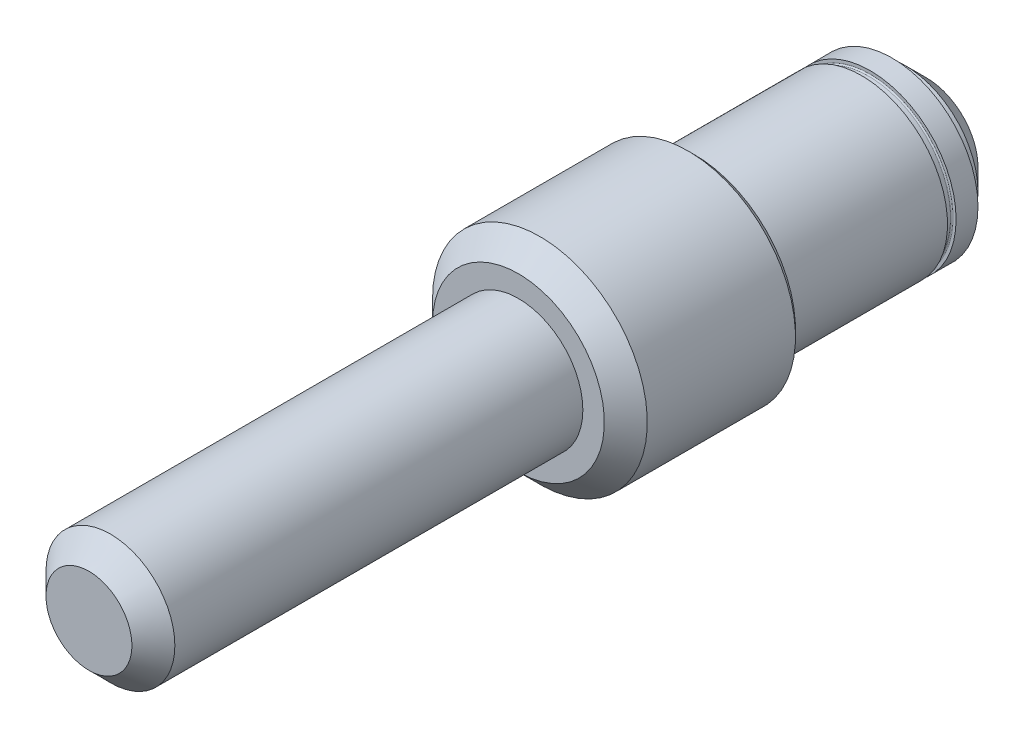
ISO-10303-21;
HEADER;
FILE_DESCRIPTION(('STEP AP214'),'2;1');
FILE_NAME('part.step','',(''),(''),'','','');
FILE_SCHEMA(('AUTOMOTIVE_DESIGN { 1 0 10303 214 1 1 1 1 }'));
ENDSEC;
DATA;
#1=APPLICATION_CONTEXT('core data for automotive mechanical design processes');
#2=APPLICATION_PROTOCOL_DEFINITION('international standard','automotive_design',2000,#1);
#3=PRODUCT_CONTEXT('',#1,'mechanical');
#4=PRODUCT('Part','Part','',(#3));
#5=PRODUCT_RELATED_PRODUCT_CATEGORY('part','',(#4));
#6=PRODUCT_DEFINITION_FORMATION('','',#4);
#7=PRODUCT_DEFINITION_CONTEXT('part definition',#1,'design');
#8=PRODUCT_DEFINITION('design','',#6,#7);
#9=PRODUCT_DEFINITION_SHAPE('','',#8);
#10=(LENGTH_UNIT() NAMED_UNIT(*) SI_UNIT(.MILLI.,.METRE.));
#11=(NAMED_UNIT(*) PLANE_ANGLE_UNIT() SI_UNIT($,.RADIAN.));
#12=(NAMED_UNIT(*) SI_UNIT($,.STERADIAN.) SOLID_ANGLE_UNIT());
#13=UNCERTAINTY_MEASURE_WITH_UNIT(LENGTH_MEASURE(1.E-05),#10,'distance_accuracy_value','');
#14=(GEOMETRIC_REPRESENTATION_CONTEXT(3) GLOBAL_UNCERTAINTY_ASSIGNED_CONTEXT((#13)) GLOBAL_UNIT_ASSIGNED_CONTEXT((#10,
#11,#12)) REPRESENTATION_CONTEXT('',''));
#15=CARTESIAN_POINT('',(0.,0.,0.));
#16=DIRECTION('',(0.,0.,1.));
#17=DIRECTION('',(1.,0.,0.));
#18=AXIS2_PLACEMENT_3D('',#15,#16,#17);
#19=CARTESIAN_POINT('',(0.,0.,0.));
#20=DIRECTION('',(0.,0.,1.));
#21=DIRECTION('',(1.,0.,0.));
#22=AXIS2_PLACEMENT_3D('',#19,#20,#21);
#23=CYLINDRICAL_SURFACE('',#22,20.);
#24=CARTESIAN_POINT('',(0.,0.,-179.9));
#25=DIRECTION('',(0.,0.,-1.));
#26=DIRECTION('',(-1.,0.,0.));
#27=AXIS2_PLACEMENT_3D('',#24,#25,#26);
#28=CIRCLE('',#27,20.);
#29=CARTESIAN_POINT('',(-20.,0.,-179.9));
#30=VERTEX_POINT('',#29);
#31=EDGE_CURVE('E215',#30,#30,#28,.T.);
#32=ORIENTED_EDGE('',*,*,#31,.F.);
#33=EDGE_LOOP('',(#32));
#34=FACE_BOUND('',#33,.T.);
#35=CARTESIAN_POINT('',(0.,0.,-141.));
#36=DIRECTION('',(0.,0.,-1.));
#37=DIRECTION('',(-1.,0.,0.));
#38=AXIS2_PLACEMENT_3D('',#35,#36,#37);
#39=CIRCLE('',#38,20.);
#40=CARTESIAN_POINT('',(-20.,0.,-141.));
#41=VERTEX_POINT('',#40);
#42=EDGE_CURVE('E213',#41,#41,#39,.T.);
#43=ORIENTED_EDGE('',*,*,#42,.T.);
#44=EDGE_LOOP('',(#43));
#45=FACE_BOUND('',#44,.T.);
#46=ADVANCED_FACE('F43',(#34,#45),#23,.T.);
#47=CARTESIAN_POINT('',(0.,0.,-179.9));
#48=DIRECTION('',(0.,0.,-1.));
#49=DIRECTION('',(-1.,0.,0.));
#50=AXIS2_PLACEMENT_3D('',#47,#48,#49);
#51=PLANE('',#50);
#52=CARTESIAN_POINT('',(0.,0.,-179.9));
#53=DIRECTION('',(0.,0.,-1.));
#54=DIRECTION('',(-1.,0.,0.));
#55=AXIS2_PLACEMENT_3D('',#52,#53,#54);
#56=CIRCLE('',#55,19.3);
#57=CARTESIAN_POINT('',(-19.3,0.,-179.9));
#58=VERTEX_POINT('',#57);
#59=EDGE_CURVE('E144',#58,#58,#56,.F.);
#60=ORIENTED_EDGE('',*,*,#59,.T.);
#61=EDGE_LOOP('',(#60));
#62=FACE_BOUND('',#61,.T.);
#63=ORIENTED_EDGE('',*,*,#31,.T.);
#64=EDGE_LOOP('',(#63));
#65=FACE_BOUND('',#64,.T.);
#66=ADVANCED_FACE('F74',(#62,#65),#51,.T.);
#67=CARTESIAN_POINT('',(0.,0.,-181.9));
#68=DIRECTION('',(0.,0.,-1.));
#69=DIRECTION('',(-1.,0.,0.));
#70=AXIS2_PLACEMENT_3D('',#67,#68,#69);
#71=PLANE('',#70);
#72=CARTESIAN_POINT('',(0.,0.,-181.9));
#73=DIRECTION('',(0.,0.,-1.));
#74=DIRECTION('',(-1.,0.,0.));
#75=AXIS2_PLACEMENT_3D('',#72,#73,#74);
#76=CIRCLE('',#75,19.3);
#77=CARTESIAN_POINT('',(-19.3,0.,-181.9));
#78=VERTEX_POINT('',#77);
#79=EDGE_CURVE('E150',#78,#78,#76,.T.);
#80=ORIENTED_EDGE('',*,*,#79,.T.);
#81=EDGE_LOOP('',(#80));
#82=FACE_BOUND('',#81,.T.);
#83=CARTESIAN_POINT('',(0.,0.,-181.9));
#84=DIRECTION('',(0.,0.,-1.));
#85=DIRECTION('',(-1.,0.,0.));
#86=AXIS2_PLACEMENT_3D('',#83,#84,#85);
#87=CIRCLE('',#86,20.);
#88=CARTESIAN_POINT('',(-20.,0.,-181.9));
#89=VERTEX_POINT('',#88);
#90=EDGE_CURVE('E106',#89,#89,#87,.T.);
#91=ORIENTED_EDGE('',*,*,#90,.F.);
#92=EDGE_LOOP('',(#91));
#93=FACE_BOUND('',#92,.T.);
#94=ADVANCED_FACE('F66',(#82,#93),#71,.F.);
#95=CARTESIAN_POINT('',(0.,0.,-179.9));
#96=DIRECTION('',(0.,0.,-1.));
#97=DIRECTION('',(-1.,0.,0.));
#98=AXIS2_PLACEMENT_3D('',#95,#96,#97);
#99=CYLINDRICAL_SURFACE('',#98,19.);
#100=CARTESIAN_POINT('',(0.,0.,-180.2));
#101=DIRECTION('',(0.,0.,-1.));
#102=DIRECTION('',(-1.,0.,0.));
#103=AXIS2_PLACEMENT_3D('',#100,#101,#102);
#104=CIRCLE('',#103,19.);
#105=CARTESIAN_POINT('',(-19.,0.,-180.2));
#106=VERTEX_POINT('',#105);
#107=EDGE_CURVE('E142',#106,#106,#104,.T.);
#108=ORIENTED_EDGE('',*,*,#107,.T.);
#109=EDGE_LOOP('',(#108));
#110=FACE_BOUND('',#109,.T.);
#111=CARTESIAN_POINT('',(0.,0.,-181.6));
#112=DIRECTION('',(0.,0.,-1.));
#113=DIRECTION('',(-1.,0.,0.));
#114=AXIS2_PLACEMENT_3D('',#111,#112,#113);
#115=CIRCLE('',#114,19.);
#116=CARTESIAN_POINT('',(-19.,0.,-181.6));
#117=VERTEX_POINT('',#116);
#118=EDGE_CURVE('E137',#117,#117,#115,.F.);
#119=ORIENTED_EDGE('',*,*,#118,.T.);
#120=EDGE_LOOP('',(#119));
#121=FACE_BOUND('',#120,.T.);
#122=ADVANCED_FACE('F60',(#110,#121),#99,.T.);
#123=CARTESIAN_POINT('',(0.,0.,-190.));
#124=DIRECTION('',(0.,0.,-1.));
#125=DIRECTION('',(-1.,0.,0.));
#126=AXIS2_PLACEMENT_3D('',#123,#124,#125);
#127=CONICAL_SURFACE('',#126,0.,0.785398163397451);
#128=CARTESIAN_POINT('',(0.,0.,-195.));
#129=DIRECTION('',(0.,0.,1.));
#130=DIRECTION('',(1.,0.,0.));
#131=AXIS2_PLACEMENT_3D('',#128,#129,#130);
#132=CIRCLE('',#131,5.);
#133=CARTESIAN_POINT('',(5.,0.,-195.));
#134=VERTEX_POINT('',#133);
#135=EDGE_CURVE('E120',#134,#134,#132,.T.);
#136=ORIENTED_EDGE('',*,*,#135,.F.);
#137=EDGE_LOOP('',(#136));
#138=FACE_BOUND('',#137,.T.);
#139=CARTESIAN_POINT('',(0.,0.,-190.));
#140=VERTEX_POINT('',#139);
#141=VERTEX_LOOP('',#140);
#142=FACE_BOUND('',#141,.T.);
#143=ADVANCED_FACE('F53',(#138,#142),#127,.F.);
#144=CARTESIAN_POINT('',(0.,17.,-195.));
#145=DIRECTION('',(0.,0.,1.));
#146=DIRECTION('',(1.,0.,0.));
#147=AXIS2_PLACEMENT_3D('',#144,#145,#146);
#148=PLANE('',#147);
#149=CARTESIAN_POINT('',(0.,0.,-195.));
#150=DIRECTION('',(0.,0.,1.));
#151=DIRECTION('',(1.,0.,0.));
#152=AXIS2_PLACEMENT_3D('',#149,#150,#151);
#153=CIRCLE('',#152,12.);
#154=CARTESIAN_POINT('',(12.,0.,-195.));
#155=VERTEX_POINT('',#154);
#156=EDGE_CURVE('E133',#155,#155,#153,.F.);
#157=ORIENTED_EDGE('',*,*,#156,.T.);
#158=EDGE_LOOP('',(#157));
#159=FACE_BOUND('',#158,.T.);
#160=ORIENTED_EDGE('',*,*,#135,.T.);
#161=EDGE_LOOP('',(#160));
#162=FACE_BOUND('',#161,.T.);
#163=ADVANCED_FACE('F57',(#159,#162),#148,.F.);
#164=CARTESIAN_POINT('',(0.,0.,-190.));
#165=DIRECTION('',(0.,0.,1.));
#166=DIRECTION('',(1.,0.,0.));
#167=AXIS2_PLACEMENT_3D('',#164,#165,#166);
#168=CONICAL_SURFACE('',#167,17.,0.785398163397452);
#169=ORIENTED_EDGE('',*,*,#156,.F.);
#170=EDGE_LOOP('',(#169));
#171=FACE_BOUND('',#170,.T.);
#172=CARTESIAN_POINT('',(0.,0.,-190.));
#173=DIRECTION('',(0.,0.,1.));
#174=DIRECTION('',(1.,0.,0.));
#175=AXIS2_PLACEMENT_3D('',#172,#173,#174);
#176=CIRCLE('',#175,17.);
#177=CARTESIAN_POINT('',(17.,0.,-190.));
#178=VERTEX_POINT('',#177);
#179=EDGE_CURVE('E134',#178,#178,#176,.T.);
#180=ORIENTED_EDGE('',*,*,#179,.F.);
#181=EDGE_LOOP('',(#180));
#182=FACE_BOUND('',#181,.T.);
#183=ADVANCED_FACE('F61',(#171,#182),#168,.T.);
#184=CARTESIAN_POINT('',(0.,0.,0.));
#185=DIRECTION('',(0.,0.,1.));
#186=DIRECTION('',(1.,0.,0.));
#187=AXIS2_PLACEMENT_3D('',#184,#185,#186);
#188=CYLINDRICAL_SURFACE('',#187,17.);
#189=ORIENTED_EDGE('',*,*,#179,.T.);
#190=EDGE_LOOP('',(#189));
#191=FACE_BOUND('',#190,.T.);
#192=CARTESIAN_POINT('',(0.,0.,-187.));
#193=DIRECTION('',(0.,0.,1.));
#194=DIRECTION('',(1.,0.,0.));
#195=AXIS2_PLACEMENT_3D('',#192,#193,#194);
#196=CIRCLE('',#195,17.);
#197=CARTESIAN_POINT('',(17.,0.,-187.));
#198=VERTEX_POINT('',#197);
#199=EDGE_CURVE('E111',#198,#198,#196,.T.);
#200=ORIENTED_EDGE('',*,*,#199,.F.);
#201=EDGE_LOOP('',(#200));
#202=FACE_BOUND('',#201,.T.);
#203=ADVANCED_FACE('F103',(#191,#202),#188,.T.);
#204=CARTESIAN_POINT('',(0.,20.,-187.));
#205=DIRECTION('',(0.,0.,1.));
#206=DIRECTION('',(1.,0.,0.));
#207=AXIS2_PLACEMENT_3D('',#204,#205,#206);
#208=PLANE('',#207);
#209=CARTESIAN_POINT('',(0.,0.,-187.));
#210=DIRECTION('',(0.,0.,1.));
#211=DIRECTION('',(1.,0.,0.));
#212=AXIS2_PLACEMENT_3D('',#209,#210,#211);
#213=CIRCLE('',#212,20.);
#214=CARTESIAN_POINT('',(20.,0.,-187.));
#215=VERTEX_POINT('',#214);
#216=EDGE_CURVE('E107',#215,#215,#213,.T.);
#217=ORIENTED_EDGE('',*,*,#216,.F.);
#218=EDGE_LOOP('',(#217));
#219=FACE_BOUND('',#218,.T.);
#220=ORIENTED_EDGE('',*,*,#199,.T.);
#221=EDGE_LOOP('',(#220));
#222=FACE_BOUND('',#221,.T.);
#223=ADVANCED_FACE('F95',(#219,#222),#208,.F.);
#224=ORIENTED_EDGE('',*,*,#90,.T.);
#225=EDGE_LOOP('',(#224));
#226=FACE_BOUND('',#225,.T.);
#227=ORIENTED_EDGE('',*,*,#216,.T.);
#228=EDGE_LOOP('',(#227));
#229=FACE_BOUND('',#228,.T.);
#230=ADVANCED_FACE('F76',(#226,#229),#23,.T.);
#231=CARTESIAN_POINT('',(0.,0.,-180.2));
#232=DIRECTION('',(0.,0.,-1.));
#233=DIRECTION('',(-1.,0.,0.));
#234=AXIS2_PLACEMENT_3D('',#231,#232,#233);
#235=TOROIDAL_SURFACE('',#234,19.3,0.3);
#236=ORIENTED_EDGE('',*,*,#59,.F.);
#237=EDGE_LOOP('',(#236));
#238=FACE_BOUND('',#237,.T.);
#239=ORIENTED_EDGE('',*,*,#107,.F.);
#240=EDGE_LOOP('',(#239));
#241=FACE_BOUND('',#240,.T.);
#242=ADVANCED_FACE('F91',(#238,#241),#235,.F.);
#243=CARTESIAN_POINT('',(0.,0.,-181.6));
#244=DIRECTION('',(0.,0.,-1.));
#245=DIRECTION('',(-1.,0.,0.));
#246=AXIS2_PLACEMENT_3D('',#243,#244,#245);
#247=TOROIDAL_SURFACE('',#246,19.3,0.3);
#248=ORIENTED_EDGE('',*,*,#118,.F.);
#249=EDGE_LOOP('',(#248));
#250=FACE_BOUND('',#249,.T.);
#251=ORIENTED_EDGE('',*,*,#79,.F.);
#252=EDGE_LOOP('',(#251));
#253=FACE_BOUND('',#252,.T.);
#254=ADVANCED_FACE('F96',(#250,#253),#247,.F.);
#255=CARTESIAN_POINT('',(0.,0.,-141.));
#256=DIRECTION('',(0.,0.,-1.));
#257=DIRECTION('',(-1.,0.,0.));
#258=AXIS2_PLACEMENT_3D('',#255,#256,#257);
#259=PLANE('',#258);
#260=CARTESIAN_POINT('',(0.,0.,-141.));
#261=DIRECTION('',(0.,0.,-1.));
#262=DIRECTION('',(-1.,0.,0.));
#263=AXIS2_PLACEMENT_3D('',#260,#261,#262);
#264=CIRCLE('',#263,23.5);
#265=CARTESIAN_POINT('',(-23.5,0.,-141.));
#266=VERTEX_POINT('',#265);
#267=EDGE_CURVE('E51',#266,#266,#264,.T.);
#268=ORIENTED_EDGE('',*,*,#267,.T.);
#269=EDGE_LOOP('',(#268));
#270=FACE_BOUND('',#269,.T.);
#271=ORIENTED_EDGE('',*,*,#42,.F.);
#272=EDGE_LOOP('',(#271));
#273=FACE_BOUND('',#272,.T.);
#274=ADVANCED_FACE('F154',(#270,#273),#259,.T.);
#275=CARTESIAN_POINT('',(0.,0.,0.));
#276=DIRECTION('',(0.,0.,-1.));
#277=DIRECTION('',(-1.,0.,0.));
#278=AXIS2_PLACEMENT_3D('',#275,#276,#277);
#279=PLANE('',#278);
#280=CARTESIAN_POINT('',(0.,0.,0.));
#281=DIRECTION('',(0.,0.,-1.));
#282=DIRECTION('',(-1.,0.,0.));
#283=AXIS2_PLACEMENT_3D('',#280,#281,#282);
#284=CIRCLE('',#283,10.);
#285=CARTESIAN_POINT('',(-10.,0.,0.));
#286=VERTEX_POINT('',#285);
#287=EDGE_CURVE('E127',#286,#286,#284,.F.);
#288=ORIENTED_EDGE('',*,*,#287,.T.);
#289=EDGE_LOOP('',(#288));
#290=FACE_BOUND('',#289,.T.);
#291=ADVANCED_FACE('F187',(#290),#279,.F.);
#292=CARTESIAN_POINT('',(0.,0.,0.));
#293=DIRECTION('',(0.,0.,-1.));
#294=DIRECTION('',(-1.,0.,0.));
#295=AXIS2_PLACEMENT_3D('',#292,#293,#294);
#296=CONICAL_SURFACE('',#295,10.,0.785398163397446);
#297=CARTESIAN_POINT('',(0.,0.,-5.00000000000002));
#298=DIRECTION('',(0.,0.,-1.));
#299=DIRECTION('',(-1.,0.,0.));
#300=AXIS2_PLACEMENT_3D('',#297,#298,#299);
#301=CIRCLE('',#300,15.);
#302=CARTESIAN_POINT('',(-15.,0.,-5.00000000000002));
#303=VERTEX_POINT('',#302);
#304=EDGE_CURVE('E129',#303,#303,#301,.T.);
#305=ORIENTED_EDGE('',*,*,#304,.F.);
#306=EDGE_LOOP('',(#305));
#307=FACE_BOUND('',#306,.T.);
#308=ORIENTED_EDGE('',*,*,#287,.F.);
#309=EDGE_LOOP('',(#308));
#310=FACE_BOUND('',#309,.T.);
#311=ADVANCED_FACE('F179',(#307,#310),#296,.T.);
#312=CARTESIAN_POINT('',(0.,0.,0.));
#313=DIRECTION('',(0.,0.,1.));
#314=DIRECTION('',(1.,0.,0.));
#315=AXIS2_PLACEMENT_3D('',#312,#313,#314);
#316=CYLINDRICAL_SURFACE('',#315,15.);
#317=ORIENTED_EDGE('',*,*,#304,.T.);
#318=EDGE_LOOP('',(#317));
#319=FACE_BOUND('',#318,.T.);
#320=CARTESIAN_POINT('',(0.,0.,-100.));
#321=DIRECTION('',(0.,0.,1.));
#322=DIRECTION('',(1.,0.,0.));
#323=AXIS2_PLACEMENT_3D('',#320,#321,#322);
#324=CIRCLE('',#323,15.);
#325=CARTESIAN_POINT('',(15.,0.,-100.));
#326=VERTEX_POINT('',#325);
#327=EDGE_CURVE('E109',#326,#326,#324,.T.);
#328=ORIENTED_EDGE('',*,*,#327,.T.);
#329=EDGE_LOOP('',(#328));
#330=FACE_BOUND('',#329,.T.);
#331=ADVANCED_FACE('F174',(#319,#330),#316,.T.);
#332=CARTESIAN_POINT('',(0.,15.,-100.));
#333=DIRECTION('',(0.,0.,-1.));
#334=DIRECTION('',(-1.,0.,0.));
#335=AXIS2_PLACEMENT_3D('',#332,#333,#334);
#336=PLANE('',#335);
#337=CARTESIAN_POINT('',(0.,0.,-100.));
#338=DIRECTION('',(0.,0.,-1.));
#339=DIRECTION('',(-1.,0.,0.));
#340=AXIS2_PLACEMENT_3D('',#337,#338,#339);
#341=CIRCLE('',#340,20.);
#342=CARTESIAN_POINT('',(-20.,0.,-100.));
#343=VERTEX_POINT('',#342);
#344=EDGE_CURVE('E112',#343,#343,#341,.F.);
#345=ORIENTED_EDGE('',*,*,#344,.T.);
#346=EDGE_LOOP('',(#345));
#347=FACE_BOUND('',#346,.T.);
#348=ORIENTED_EDGE('',*,*,#327,.F.);
#349=EDGE_LOOP('',(#348));
#350=FACE_BOUND('',#349,.T.);
#351=ADVANCED_FACE('F169',(#347,#350),#336,.F.);
#352=CARTESIAN_POINT('',(0.,0.,-100.));
#353=DIRECTION('',(0.,0.,-1.));
#354=DIRECTION('',(-1.,0.,0.));
#355=AXIS2_PLACEMENT_3D('',#352,#353,#354);
#356=CONICAL_SURFACE('',#355,20.,0.785398163397445);
#357=CARTESIAN_POINT('',(0.,0.,-105.));
#358=DIRECTION('',(0.,0.,-1.));
#359=DIRECTION('',(-1.,0.,0.));
#360=AXIS2_PLACEMENT_3D('',#357,#358,#359);
#361=CIRCLE('',#360,25.);
#362=CARTESIAN_POINT('',(-25.,0.,-105.));
#363=VERTEX_POINT('',#362);
#364=EDGE_CURVE('E124',#363,#363,#361,.T.);
#365=ORIENTED_EDGE('',*,*,#364,.F.);
#366=EDGE_LOOP('',(#365));
#367=FACE_BOUND('',#366,.T.);
#368=ORIENTED_EDGE('',*,*,#344,.F.);
#369=EDGE_LOOP('',(#368));
#370=FACE_BOUND('',#369,.T.);
#371=ADVANCED_FACE('F163',(#367,#370),#356,.T.);
#372=CARTESIAN_POINT('',(0.,0.,0.));
#373=DIRECTION('',(0.,0.,1.));
#374=DIRECTION('',(1.,0.,0.));
#375=AXIS2_PLACEMENT_3D('',#372,#373,#374);
#376=CYLINDRICAL_SURFACE('',#375,25.);
#377=CARTESIAN_POINT('',(0.,0.,-139.5));
#378=DIRECTION('',(0.,0.,-1.));
#379=DIRECTION('',(-1.,0.,0.));
#380=AXIS2_PLACEMENT_3D('',#377,#378,#379);
#381=CIRCLE('',#380,25.);
#382=CARTESIAN_POINT('',(-25.,0.,-139.5));
#383=VERTEX_POINT('',#382);
#384=EDGE_CURVE('E11',#383,#383,#381,.F.);
#385=ORIENTED_EDGE('',*,*,#384,.T.);
#386=EDGE_LOOP('',(#385));
#387=FACE_BOUND('',#386,.T.);
#388=ORIENTED_EDGE('',*,*,#364,.T.);
#389=EDGE_LOOP('',(#388));
#390=FACE_BOUND('',#389,.T.);
#391=ADVANCED_FACE('F156',(#387,#390),#376,.T.);
#392=CARTESIAN_POINT('',(0.,0.,-141.));
#393=DIRECTION('',(0.,0.,1.));
#394=DIRECTION('',(1.,0.,0.));
#395=AXIS2_PLACEMENT_3D('',#392,#393,#394);
#396=CONICAL_SURFACE('',#395,23.5,0.78539816339745);
#397=ORIENTED_EDGE('',*,*,#384,.F.);
#398=EDGE_LOOP('',(#397));
#399=FACE_BOUND('',#398,.T.);
#400=ORIENTED_EDGE('',*,*,#267,.F.);
#401=EDGE_LOOP('',(#400));
#402=FACE_BOUND('',#401,.T.);
#403=ADVANCED_FACE('F46',(#399,#402),#396,.T.);
#404=CLOSED_SHELL('',(#46,#66,#94,#122,#143,#163,#183,#203,#223,#230,#242,#254,#274,#291,#311,
#331,#351,#371,#391,#403));
#405=MANIFOLD_SOLID_BREP('B2',#404);
#406=ADVANCED_BREP_SHAPE_REPRESENTATION('',(#18,#405),#14);
#407=SHAPE_DEFINITION_REPRESENTATION(#9,#406);
ENDSEC;
END-ISO-10303-21;
